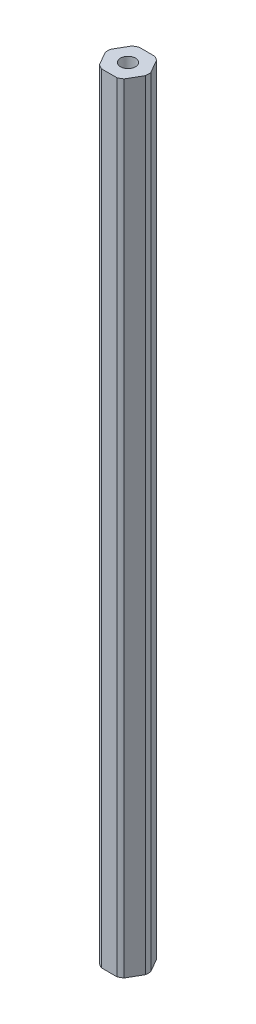
ISO-10303-21;
HEADER;
FILE_DESCRIPTION(('STEP AP214'),'2;1');
FILE_NAME('part.step','',(''),(''),'','','');
FILE_SCHEMA(('AUTOMOTIVE_DESIGN { 1 0 10303 214 1 1 1 1 }'));
ENDSEC;
DATA;
#1=APPLICATION_CONTEXT('core data for automotive mechanical design processes');
#2=APPLICATION_PROTOCOL_DEFINITION('international standard','automotive_design',2000,#1);
#3=PRODUCT_CONTEXT('',#1,'mechanical');
#4=PRODUCT('Part','Part','',(#3));
#5=PRODUCT_RELATED_PRODUCT_CATEGORY('part','',(#4));
#6=PRODUCT_DEFINITION_FORMATION('','',#4);
#7=PRODUCT_DEFINITION_CONTEXT('part definition',#1,'design');
#8=PRODUCT_DEFINITION('design','',#6,#7);
#9=PRODUCT_DEFINITION_SHAPE('','',#8);
#10=(LENGTH_UNIT() NAMED_UNIT(*) SI_UNIT(.MILLI.,.METRE.));
#11=(NAMED_UNIT(*) PLANE_ANGLE_UNIT() SI_UNIT($,.RADIAN.));
#12=(NAMED_UNIT(*) SI_UNIT($,.STERADIAN.) SOLID_ANGLE_UNIT());
#13=UNCERTAINTY_MEASURE_WITH_UNIT(LENGTH_MEASURE(1.E-05),#10,'distance_accuracy_value','');
#14=(GEOMETRIC_REPRESENTATION_CONTEXT(3) GLOBAL_UNCERTAINTY_ASSIGNED_CONTEXT((#13)) GLOBAL_UNIT_ASSIGNED_CONTEXT((#10,
#11,#12)) REPRESENTATION_CONTEXT('',''));
#15=CARTESIAN_POINT('',(0.,0.,0.));
#16=DIRECTION('',(0.,0.,1.));
#17=DIRECTION('',(1.,0.,0.));
#18=AXIS2_PLACEMENT_3D('',#15,#16,#17);
#19=CARTESIAN_POINT('',(-5.49926131403119,-263.525,-3.175));
#20=DIRECTION('',(0.866025403784439,0.,0.5));
#21=DIRECTION('',(0.5,0.,-0.866025403784439));
#22=AXIS2_PLACEMENT_3D('',#19,#20,#21);
#23=PLANE('',#22);
#24=DIRECTION('',(0.5,0.,-0.866025403784439));
#25=VECTOR('',#24,1.);
#26=CARTESIAN_POINT('',(-5.49926131403119,0.,-3.175));
#27=LINE('',#26,#25);
#28=CARTESIAN_POINT('',(-6.81675182633099,0.,-0.893039494206793));
#29=VERTEX_POINT('',#28);
#30=CARTESIAN_POINT('',(-4.18177080173138,0.,-5.45696050579321));
#31=VERTEX_POINT('',#30);
#32=EDGE_CURVE('E155',#29,#31,#27,.T.);
#33=ORIENTED_EDGE('',*,*,#32,.T.);
#34=DIRECTION('',(0.,1.,0.));
#35=VECTOR('',#34,1.);
#36=CARTESIAN_POINT('',(-4.18177080173138,-263.525,-5.45696050579321));
#37=LINE('',#36,#35);
#38=CARTESIAN_POINT('',(-4.18177080173138,-263.525,-5.45696050579321));
#39=VERTEX_POINT('',#38);
#40=EDGE_CURVE('E156',#31,#39,#37,.F.);
#41=ORIENTED_EDGE('',*,*,#40,.T.);
#42=DIRECTION('',(0.5,0.,-0.866025403784439));
#43=VECTOR('',#42,1.);
#44=CARTESIAN_POINT('',(-5.49926131403119,-263.525,-3.175));
#45=LINE('',#44,#43);
#46=CARTESIAN_POINT('',(-6.81675182633099,-263.525,-0.893039494206793));
#47=VERTEX_POINT('',#46);
#48=EDGE_CURVE('E136',#47,#39,#45,.T.);
#49=ORIENTED_EDGE('',*,*,#48,.F.);
#50=DIRECTION('',(0.,1.,0.));
#51=VECTOR('',#50,1.);
#52=CARTESIAN_POINT('',(-6.81675182633099,-263.525,-0.893039494206796));
#53=LINE('',#52,#51);
#54=EDGE_CURVE('E129',#47,#29,#53,.T.);
#55=ORIENTED_EDGE('',*,*,#54,.T.);
#56=EDGE_LOOP('',(#33,#41,#49,#55));
#57=FACE_BOUND('',#56,.T.);
#58=ADVANCED_FACE('F17',(#57),#23,.F.);
#59=CARTESIAN_POINT('',(0.,-263.525,-6.35));
#60=DIRECTION('',(0.,0.,1.));
#61=DIRECTION('',(1.,0.,0.));
#62=AXIS2_PLACEMENT_3D('',#59,#60,#61);
#63=PLANE('',#62);
#64=DIRECTION('',(1.,0.,0.));
#65=VECTOR('',#64,1.);
#66=CARTESIAN_POINT('',(0.,0.,-6.35));
#67=LINE('',#66,#65);
#68=CARTESIAN_POINT('',(-2.63498102459961,0.,-6.35));
#69=VERTEX_POINT('',#68);
#70=CARTESIAN_POINT('',(2.63498102459961,0.,-6.35));
#71=VERTEX_POINT('',#70);
#72=EDGE_CURVE('E128',#69,#71,#67,.T.);
#73=ORIENTED_EDGE('',*,*,#72,.T.);
#74=DIRECTION('',(0.,1.,0.));
#75=VECTOR('',#74,1.);
#76=CARTESIAN_POINT('',(2.63498102459961,-263.525,-6.35));
#77=LINE('',#76,#75);
#78=CARTESIAN_POINT('',(2.63498102459961,-263.525,-6.35));
#79=VERTEX_POINT('',#78);
#80=EDGE_CURVE('E110',#71,#79,#77,.F.);
#81=ORIENTED_EDGE('',*,*,#80,.T.);
#82=DIRECTION('',(1.,0.,0.));
#83=VECTOR('',#82,1.);
#84=CARTESIAN_POINT('',(0.,-263.525,-6.35));
#85=LINE('',#84,#83);
#86=CARTESIAN_POINT('',(-2.63498102459961,-263.525,-6.35));
#87=VERTEX_POINT('',#86);
#88=EDGE_CURVE('E126',#87,#79,#85,.T.);
#89=ORIENTED_EDGE('',*,*,#88,.F.);
#90=DIRECTION('',(0.,1.,0.));
#91=VECTOR('',#90,1.);
#92=CARTESIAN_POINT('',(-2.63498102459961,-263.525,-6.35));
#93=LINE('',#92,#91);
#94=EDGE_CURVE('E130',#87,#69,#93,.T.);
#95=ORIENTED_EDGE('',*,*,#94,.T.);
#96=EDGE_LOOP('',(#73,#81,#89,#95));
#97=FACE_BOUND('',#96,.T.);
#98=ADVANCED_FACE('F125',(#97),#63,.F.);
#99=CARTESIAN_POINT('',(5.49926131403119,-263.525,-3.175));
#100=DIRECTION('',(-0.866025403784439,0.,0.5));
#101=DIRECTION('',(0.5,0.,0.866025403784439));
#102=AXIS2_PLACEMENT_3D('',#99,#100,#101);
#103=PLANE('',#102);
#104=DIRECTION('',(0.5,0.,0.866025403784439));
#105=VECTOR('',#104,1.);
#106=CARTESIAN_POINT('',(5.49926131403119,0.,-3.175));
#107=LINE('',#106,#105);
#108=CARTESIAN_POINT('',(4.18177080173138,0.,-5.45696050579321));
#109=VERTEX_POINT('',#108);
#110=CARTESIAN_POINT('',(6.81675182633099,0.,-0.893039494206797));
#111=VERTEX_POINT('',#110);
#112=EDGE_CURVE('E160',#109,#111,#107,.T.);
#113=ORIENTED_EDGE('',*,*,#112,.T.);
#114=DIRECTION('',(0.,1.,0.));
#115=VECTOR('',#114,1.);
#116=CARTESIAN_POINT('',(6.81675182633099,-263.525,-0.8930394942068));
#117=LINE('',#116,#115);
#118=CARTESIAN_POINT('',(6.81675182633099,-263.525,-0.893039494206797));
#119=VERTEX_POINT('',#118);
#120=EDGE_CURVE('E184',#111,#119,#117,.F.);
#121=ORIENTED_EDGE('',*,*,#120,.T.);
#122=DIRECTION('',(0.5,0.,0.866025403784439));
#123=VECTOR('',#122,1.);
#124=CARTESIAN_POINT('',(5.49926131403119,-263.525,-3.175));
#125=LINE('',#124,#123);
#126=CARTESIAN_POINT('',(4.18177080173138,-263.525,-5.45696050579321));
#127=VERTEX_POINT('',#126);
#128=EDGE_CURVE('E135',#127,#119,#125,.T.);
#129=ORIENTED_EDGE('',*,*,#128,.F.);
#130=DIRECTION('',(0.,1.,0.));
#131=VECTOR('',#130,1.);
#132=CARTESIAN_POINT('',(4.18177080173139,-263.525,-5.4569605057932));
#133=LINE('',#132,#131);
#134=EDGE_CURVE('E113',#127,#109,#133,.T.);
#135=ORIENTED_EDGE('',*,*,#134,.T.);
#136=EDGE_LOOP('',(#113,#121,#129,#135));
#137=FACE_BOUND('',#136,.T.);
#138=ADVANCED_FACE('F231',(#137),#103,.F.);
#139=CARTESIAN_POINT('',(5.49926131403119,-263.525,3.175));
#140=DIRECTION('',(-0.866025403784439,0.,-0.5));
#141=DIRECTION('',(-0.5,0.,0.866025403784439));
#142=AXIS2_PLACEMENT_3D('',#139,#140,#141);
#143=PLANE('',#142);
#144=DIRECTION('',(-0.5,0.,0.866025403784439));
#145=VECTOR('',#144,1.);
#146=CARTESIAN_POINT('',(5.49926131403119,0.,3.175));
#147=LINE('',#146,#145);
#148=CARTESIAN_POINT('',(6.81675182633099,0.,0.893039494206778));
#149=VERTEX_POINT('',#148);
#150=CARTESIAN_POINT('',(4.18177080173137,0.,5.45696050579322));
#151=VERTEX_POINT('',#150);
#152=EDGE_CURVE('E163',#149,#151,#147,.T.);
#153=ORIENTED_EDGE('',*,*,#152,.T.);
#154=DIRECTION('',(0.,1.,0.));
#155=VECTOR('',#154,1.);
#156=CARTESIAN_POINT('',(4.18177080173137,-263.525,5.45696050579322));
#157=LINE('',#156,#155);
#158=CARTESIAN_POINT('',(4.18177080173137,-263.525,5.45696050579322));
#159=VERTEX_POINT('',#158);
#160=EDGE_CURVE('E188',#151,#159,#157,.F.);
#161=ORIENTED_EDGE('',*,*,#160,.T.);
#162=DIRECTION('',(-0.5,0.,0.866025403784439));
#163=VECTOR('',#162,1.);
#164=CARTESIAN_POINT('',(5.49926131403119,-263.525,3.175));
#165=LINE('',#164,#163);
#166=CARTESIAN_POINT('',(6.81675182633099,-263.525,0.893039494206778));
#167=VERTEX_POINT('',#166);
#168=EDGE_CURVE('E138',#167,#159,#165,.T.);
#169=ORIENTED_EDGE('',*,*,#168,.F.);
#170=DIRECTION('',(0.,1.,0.));
#171=VECTOR('',#170,1.);
#172=CARTESIAN_POINT('',(6.81675182633099,-263.525,0.893039494206777));
#173=LINE('',#172,#171);
#174=EDGE_CURVE('E191',#167,#149,#173,.T.);
#175=ORIENTED_EDGE('',*,*,#174,.T.);
#176=EDGE_LOOP('',(#153,#161,#169,#175));
#177=FACE_BOUND('',#176,.T.);
#178=ADVANCED_FACE('F227',(#177),#143,.F.);
#179=CARTESIAN_POINT('',(0.,-263.525,6.35));
#180=DIRECTION('',(0.,0.,-1.));
#181=DIRECTION('',(-1.,0.,0.));
#182=AXIS2_PLACEMENT_3D('',#179,#180,#181);
#183=PLANE('',#182);
#184=DIRECTION('',(-1.,0.,0.));
#185=VECTOR('',#184,1.);
#186=CARTESIAN_POINT('',(0.,0.,6.35));
#187=LINE('',#186,#185);
#188=CARTESIAN_POINT('',(2.63498102459961,0.,6.35));
#189=VERTEX_POINT('',#188);
#190=CARTESIAN_POINT('',(-2.63498102459961,0.,6.35));
#191=VERTEX_POINT('',#190);
#192=EDGE_CURVE('E165',#189,#191,#187,.T.);
#193=ORIENTED_EDGE('',*,*,#192,.T.);
#194=DIRECTION('',(0.,1.,0.));
#195=VECTOR('',#194,1.);
#196=CARTESIAN_POINT('',(-2.63498102459961,-263.525,6.35));
#197=LINE('',#196,#195);
#198=CARTESIAN_POINT('',(-2.63498102459961,-263.525,6.35));
#199=VERTEX_POINT('',#198);
#200=EDGE_CURVE('E194',#191,#199,#197,.F.);
#201=ORIENTED_EDGE('',*,*,#200,.T.);
#202=DIRECTION('',(-1.,0.,0.));
#203=VECTOR('',#202,1.);
#204=CARTESIAN_POINT('',(0.,-263.525,6.35));
#205=LINE('',#204,#203);
#206=CARTESIAN_POINT('',(2.63498102459961,-263.525,6.35));
#207=VERTEX_POINT('',#206);
#208=EDGE_CURVE('E146',#207,#199,#205,.T.);
#209=ORIENTED_EDGE('',*,*,#208,.F.);
#210=DIRECTION('',(0.,1.,0.));
#211=VECTOR('',#210,1.);
#212=CARTESIAN_POINT('',(2.63498102459961,-263.525,6.35));
#213=LINE('',#212,#211);
#214=EDGE_CURVE('E196',#207,#189,#213,.T.);
#215=ORIENTED_EDGE('',*,*,#214,.T.);
#216=EDGE_LOOP('',(#193,#201,#209,#215));
#217=FACE_BOUND('',#216,.T.);
#218=ADVANCED_FACE('F212',(#217),#183,.F.);
#219=CARTESIAN_POINT('',(0.,-263.525,0.));
#220=DIRECTION('',(0.,1.,0.));
#221=DIRECTION('',(0.,0.,1.));
#222=AXIS2_PLACEMENT_3D('',#219,#220,#221);
#223=CYLINDRICAL_SURFACE('',#222,2.5499949);
#224=CARTESIAN_POINT('',(0.,-263.525,0.));
#225=DIRECTION('',(0.,-1.,0.));
#226=DIRECTION('',(0.,0.,-1.));
#227=AXIS2_PLACEMENT_3D('',#224,#225,#226);
#228=CIRCLE('',#227,2.5499949);
#229=CARTESIAN_POINT('',(0.,-263.525,-2.5499949));
#230=VERTEX_POINT('',#229);
#231=EDGE_CURVE('E140',#230,#230,#228,.T.);
#232=ORIENTED_EDGE('',*,*,#231,.T.);
#233=EDGE_LOOP('',(#232));
#234=FACE_BOUND('',#233,.T.);
#235=CARTESIAN_POINT('',(0.,0.,0.));
#236=DIRECTION('',(0.,-1.,0.));
#237=DIRECTION('',(0.,0.,-1.));
#238=AXIS2_PLACEMENT_3D('',#235,#236,#237);
#239=CIRCLE('',#238,2.5499949);
#240=CARTESIAN_POINT('',(0.,0.,-2.5499949));
#241=VERTEX_POINT('',#240);
#242=EDGE_CURVE('E152',#241,#241,#239,.T.);
#243=ORIENTED_EDGE('',*,*,#242,.F.);
#244=EDGE_LOOP('',(#243));
#245=FACE_BOUND('',#244,.T.);
#246=ADVANCED_FACE('F19',(#234,#245),#223,.F.);
#247=CARTESIAN_POINT('',(-5.49926131403119,-263.525,3.175));
#248=DIRECTION('',(0.866025403784439,0.,-0.5));
#249=DIRECTION('',(-0.5,0.,-0.866025403784439));
#250=AXIS2_PLACEMENT_3D('',#247,#248,#249);
#251=PLANE('',#250);
#252=DIRECTION('',(-0.5,0.,-0.866025403784439));
#253=VECTOR('',#252,1.);
#254=CARTESIAN_POINT('',(-5.49926131403119,0.,3.175));
#255=LINE('',#254,#253);
#256=CARTESIAN_POINT('',(-4.18177080173138,0.,5.45696050579321));
#257=VERTEX_POINT('',#256);
#258=CARTESIAN_POINT('',(-6.81675182633099,0.,0.8930394942068));
#259=VERTEX_POINT('',#258);
#260=EDGE_CURVE('E21',#257,#259,#255,.T.);
#261=ORIENTED_EDGE('',*,*,#260,.T.);
#262=DIRECTION('',(0.,1.,0.));
#263=VECTOR('',#262,1.);
#264=CARTESIAN_POINT('',(-6.81675182633099,-263.525,0.893039494206803));
#265=LINE('',#264,#263);
#266=CARTESIAN_POINT('',(-6.81675182633099,-263.525,0.893039494206801));
#267=VERTEX_POINT('',#266);
#268=EDGE_CURVE('E198',#259,#267,#265,.F.);
#269=ORIENTED_EDGE('',*,*,#268,.T.);
#270=DIRECTION('',(-0.5,0.,-0.866025403784439));
#271=VECTOR('',#270,1.);
#272=CARTESIAN_POINT('',(-5.49926131403119,-263.525,3.175));
#273=LINE('',#272,#271);
#274=CARTESIAN_POINT('',(-4.18177080173138,-263.525,5.45696050579321));
#275=VERTEX_POINT('',#274);
#276=EDGE_CURVE('E149',#275,#267,#273,.T.);
#277=ORIENTED_EDGE('',*,*,#276,.F.);
#278=DIRECTION('',(0.,1.,0.));
#279=VECTOR('',#278,1.);
#280=CARTESIAN_POINT('',(-4.18177080173138,-263.525,5.45696050579321));
#281=LINE('',#280,#279);
#282=EDGE_CURVE('E118',#275,#257,#281,.T.);
#283=ORIENTED_EDGE('',*,*,#282,.T.);
#284=EDGE_LOOP('',(#261,#269,#277,#283));
#285=FACE_BOUND('',#284,.T.);
#286=ADVANCED_FACE('F255',(#285),#251,.F.);
#287=CARTESIAN_POINT('',(0.,-263.525,0.));
#288=DIRECTION('',(0.,-1.,0.));
#289=DIRECTION('',(1.,0.,0.));
#290=AXIS2_PLACEMENT_3D('',#287,#288,#289);
#291=PLANE('',#290);
#292=ORIENTED_EDGE('',*,*,#231,.F.);
#293=EDGE_LOOP('',(#292));
#294=FACE_BOUND('',#293,.T.);
#295=ORIENTED_EDGE('',*,*,#88,.T.);
#296=CARTESIAN_POINT('',(0.,-263.525,0.));
#297=DIRECTION('',(0.,-1.,0.));
#298=DIRECTION('',(0.,0.,-1.));
#299=AXIS2_PLACEMENT_3D('',#296,#297,#298);
#300=CIRCLE('',#299,6.875);
#301=EDGE_CURVE('E107',#79,#127,#300,.T.);
#302=ORIENTED_EDGE('',*,*,#301,.T.);
#303=ORIENTED_EDGE('',*,*,#128,.T.);
#304=EDGE_CURVE('E119',#119,#167,#300,.T.);
#305=ORIENTED_EDGE('',*,*,#304,.T.);
#306=ORIENTED_EDGE('',*,*,#168,.T.);
#307=EDGE_CURVE('E222',#159,#207,#300,.T.);
#308=ORIENTED_EDGE('',*,*,#307,.T.);
#309=ORIENTED_EDGE('',*,*,#208,.T.);
#310=EDGE_CURVE('E221',#199,#275,#300,.T.);
#311=ORIENTED_EDGE('',*,*,#310,.T.);
#312=ORIENTED_EDGE('',*,*,#276,.T.);
#313=EDGE_CURVE('E35',#267,#47,#300,.T.);
#314=ORIENTED_EDGE('',*,*,#313,.T.);
#315=ORIENTED_EDGE('',*,*,#48,.T.);
#316=EDGE_CURVE('E121',#39,#87,#300,.T.);
#317=ORIENTED_EDGE('',*,*,#316,.T.);
#318=EDGE_LOOP('',(#295,#302,#303,#305,#306,#308,#309,#311,#312,#314,#315,#317));
#319=FACE_BOUND('',#318,.T.);
#320=ADVANCED_FACE('F133',(#294,#319),#291,.T.);
#321=CARTESIAN_POINT('',(0.,0.,0.));
#322=DIRECTION('',(0.,-1.,0.));
#323=DIRECTION('',(1.,0.,0.));
#324=AXIS2_PLACEMENT_3D('',#321,#322,#323);
#325=PLANE('',#324);
#326=CARTESIAN_POINT('',(0.,0.,0.));
#327=DIRECTION('',(0.,-1.,0.));
#328=DIRECTION('',(0.,0.,-1.));
#329=AXIS2_PLACEMENT_3D('',#326,#327,#328);
#330=CIRCLE('',#329,6.875);
#331=EDGE_CURVE('E28',#71,#109,#330,.T.);
#332=ORIENTED_EDGE('',*,*,#331,.F.);
#333=ORIENTED_EDGE('',*,*,#72,.F.);
#334=EDGE_CURVE('E43',#31,#69,#330,.T.);
#335=ORIENTED_EDGE('',*,*,#334,.F.);
#336=ORIENTED_EDGE('',*,*,#32,.F.);
#337=EDGE_CURVE('E200',#259,#29,#330,.T.);
#338=ORIENTED_EDGE('',*,*,#337,.F.);
#339=ORIENTED_EDGE('',*,*,#260,.F.);
#340=EDGE_CURVE('E201',#191,#257,#330,.T.);
#341=ORIENTED_EDGE('',*,*,#340,.F.);
#342=ORIENTED_EDGE('',*,*,#192,.F.);
#343=EDGE_CURVE('E26',#151,#189,#330,.T.);
#344=ORIENTED_EDGE('',*,*,#343,.F.);
#345=ORIENTED_EDGE('',*,*,#152,.F.);
#346=EDGE_CURVE('E11',#111,#149,#330,.T.);
#347=ORIENTED_EDGE('',*,*,#346,.F.);
#348=ORIENTED_EDGE('',*,*,#112,.F.);
#349=EDGE_LOOP('',(#332,#333,#335,#336,#338,#339,#341,#342,#344,#345,#347,#348));
#350=FACE_BOUND('',#349,.T.);
#351=ORIENTED_EDGE('',*,*,#242,.T.);
#352=EDGE_LOOP('',(#351));
#353=FACE_BOUND('',#352,.T.);
#354=ADVANCED_FACE('F213',(#350,#353),#325,.F.);
#355=CARTESIAN_POINT('',(0.,-263.525,0.));
#356=DIRECTION('',(0.,1.,0.));
#357=DIRECTION('',(0.,0.,1.));
#358=AXIS2_PLACEMENT_3D('',#355,#356,#357);
#359=CYLINDRICAL_SURFACE('',#358,6.875);
#360=ORIENTED_EDGE('',*,*,#340,.T.);
#361=ORIENTED_EDGE('',*,*,#282,.F.);
#362=ORIENTED_EDGE('',*,*,#310,.F.);
#363=ORIENTED_EDGE('',*,*,#200,.F.);
#364=EDGE_LOOP('',(#360,#361,#362,#363));
#365=FACE_BOUND('',#364,.T.);
#366=ADVANCED_FACE('F241',(#365),#359,.T.);
#367=ORIENTED_EDGE('',*,*,#313,.F.);
#368=ORIENTED_EDGE('',*,*,#268,.F.);
#369=ORIENTED_EDGE('',*,*,#337,.T.);
#370=ORIENTED_EDGE('',*,*,#54,.F.);
#371=EDGE_LOOP('',(#367,#368,#369,#370));
#372=FACE_BOUND('',#371,.T.);
#373=ADVANCED_FACE('F218',(#372),#359,.T.);
#374=ORIENTED_EDGE('',*,*,#343,.T.);
#375=ORIENTED_EDGE('',*,*,#214,.F.);
#376=ORIENTED_EDGE('',*,*,#307,.F.);
#377=ORIENTED_EDGE('',*,*,#160,.F.);
#378=EDGE_LOOP('',(#374,#375,#376,#377));
#379=FACE_BOUND('',#378,.T.);
#380=ADVANCED_FACE('F207',(#379),#359,.T.);
#381=ORIENTED_EDGE('',*,*,#346,.T.);
#382=ORIENTED_EDGE('',*,*,#174,.F.);
#383=ORIENTED_EDGE('',*,*,#304,.F.);
#384=ORIENTED_EDGE('',*,*,#120,.F.);
#385=EDGE_LOOP('',(#381,#382,#383,#384));
#386=FACE_BOUND('',#385,.T.);
#387=ADVANCED_FACE('F232',(#386),#359,.T.);
#388=ORIENTED_EDGE('',*,*,#331,.T.);
#389=ORIENTED_EDGE('',*,*,#134,.F.);
#390=ORIENTED_EDGE('',*,*,#301,.F.);
#391=ORIENTED_EDGE('',*,*,#80,.F.);
#392=EDGE_LOOP('',(#388,#389,#390,#391));
#393=FACE_BOUND('',#392,.T.);
#394=ADVANCED_FACE('F109',(#393),#359,.T.);
#395=ORIENTED_EDGE('',*,*,#334,.T.);
#396=ORIENTED_EDGE('',*,*,#94,.F.);
#397=ORIENTED_EDGE('',*,*,#316,.F.);
#398=ORIENTED_EDGE('',*,*,#40,.F.);
#399=EDGE_LOOP('',(#395,#396,#397,#398));
#400=FACE_BOUND('',#399,.T.);
#401=ADVANCED_FACE('F240',(#400),#359,.T.);
#402=CLOSED_SHELL('',(#58,#98,#138,#178,#218,#246,#286,#320,#354,#366,#373,#380,#387,#394,#401));
#403=MANIFOLD_SOLID_BREP('B1',#402);
#404=ADVANCED_BREP_SHAPE_REPRESENTATION('',(#18,#403),#14);
#405=SHAPE_DEFINITION_REPRESENTATION(#9,#404);
ENDSEC;
END-ISO-10303-21;
